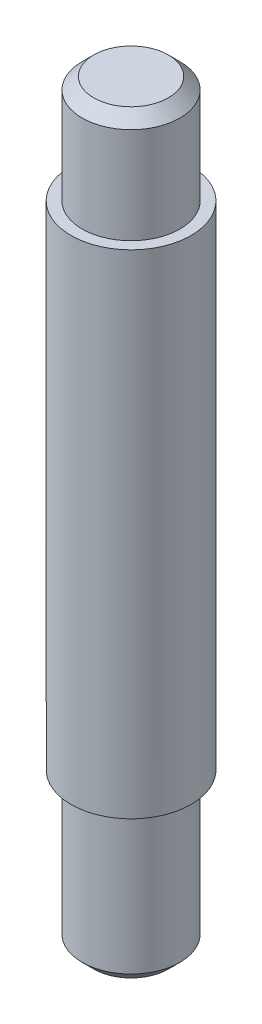
ISO-10303-21;
HEADER;
FILE_DESCRIPTION(('STEP AP214'),'2;1');
FILE_NAME('part.step','',(''),(''),'','','');
FILE_SCHEMA(('AUTOMOTIVE_DESIGN { 1 0 10303 214 1 1 1 1 }'));
ENDSEC;
DATA;
#1=APPLICATION_CONTEXT('core data for automotive mechanical design processes');
#2=APPLICATION_PROTOCOL_DEFINITION('international standard','automotive_design',2000,#1);
#3=PRODUCT_CONTEXT('',#1,'mechanical');
#4=PRODUCT('Part','Part','',(#3));
#5=PRODUCT_RELATED_PRODUCT_CATEGORY('part','',(#4));
#6=PRODUCT_DEFINITION_FORMATION('','',#4);
#7=PRODUCT_DEFINITION_CONTEXT('part definition',#1,'design');
#8=PRODUCT_DEFINITION('design','',#6,#7);
#9=PRODUCT_DEFINITION_SHAPE('','',#8);
#10=(LENGTH_UNIT() NAMED_UNIT(*) SI_UNIT(.MILLI.,.METRE.));
#11=(NAMED_UNIT(*) PLANE_ANGLE_UNIT() SI_UNIT($,.RADIAN.));
#12=(NAMED_UNIT(*) SI_UNIT($,.STERADIAN.) SOLID_ANGLE_UNIT());
#13=UNCERTAINTY_MEASURE_WITH_UNIT(LENGTH_MEASURE(1.E-05),#10,'distance_accuracy_value','');
#14=(GEOMETRIC_REPRESENTATION_CONTEXT(3) GLOBAL_UNCERTAINTY_ASSIGNED_CONTEXT((#13)) GLOBAL_UNIT_ASSIGNED_CONTEXT((#10,
#11,#12)) REPRESENTATION_CONTEXT('',''));
#15=CARTESIAN_POINT('',(0.,0.,0.));
#16=DIRECTION('',(0.,0.,1.));
#17=DIRECTION('',(1.,0.,0.));
#18=AXIS2_PLACEMENT_3D('',#15,#16,#17);
#19=CARTESIAN_POINT('',(0.,44.,0.));
#20=DIRECTION('',(0.,-1.,0.));
#21=DIRECTION('',(0.,0.,-1.));
#22=AXIS2_PLACEMENT_3D('',#19,#20,#21);
#23=CYLINDRICAL_SURFACE('',#22,3.9);
#24=CARTESIAN_POINT('',(0.,5.,0.));
#25=DIRECTION('',(0.,1.,0.));
#26=DIRECTION('',(0.,0.,1.));
#27=AXIS2_PLACEMENT_3D('',#24,#25,#26);
#28=CIRCLE('',#27,3.9);
#29=CARTESIAN_POINT('',(0.,5.,3.9));
#30=VERTEX_POINT('',#29);
#31=EDGE_CURVE('E94',#30,#30,#28,.T.);
#32=ORIENTED_EDGE('',*,*,#31,.T.);
#33=EDGE_LOOP('',(#32));
#34=FACE_BOUND('',#33,.T.);
#35=CARTESIAN_POINT('',(0.,37.,0.));
#36=DIRECTION('',(0.,-1.,0.));
#37=DIRECTION('',(0.,0.,-1.));
#38=AXIS2_PLACEMENT_3D('',#35,#36,#37);
#39=CIRCLE('',#38,3.9);
#40=CARTESIAN_POINT('',(0.,37.,-3.9));
#41=VERTEX_POINT('',#40);
#42=EDGE_CURVE('E49',#41,#41,#39,.T.);
#43=ORIENTED_EDGE('',*,*,#42,.T.);
#44=EDGE_LOOP('',(#43));
#45=FACE_BOUND('',#44,.T.);
#46=ADVANCED_FACE('F43',(#34,#45),#23,.T.);
#47=CARTESIAN_POINT('',(0.,44.,0.));
#48=DIRECTION('',(0.,-1.,0.));
#49=DIRECTION('',(0.,0.,-1.));
#50=AXIS2_PLACEMENT_3D('',#47,#48,#49);
#51=CYLINDRICAL_SURFACE('',#50,3.175);
#52=CARTESIAN_POINT('',(0.,37.,0.));
#53=DIRECTION('',(0.,-1.,0.));
#54=DIRECTION('',(0.,0.,-1.));
#55=AXIS2_PLACEMENT_3D('',#52,#53,#54);
#56=CIRCLE('',#55,3.175);
#57=CARTESIAN_POINT('',(0.,37.,-3.175));
#58=VERTEX_POINT('',#57);
#59=EDGE_CURVE('E11',#58,#58,#56,.T.);
#60=ORIENTED_EDGE('',*,*,#59,.F.);
#61=EDGE_LOOP('',(#60));
#62=FACE_BOUND('',#61,.T.);
#63=CARTESIAN_POINT('',(0.,43.24435,0.));
#64=DIRECTION('',(0.,-1.,0.));
#65=DIRECTION('',(0.,0.,-1.));
#66=AXIS2_PLACEMENT_3D('',#63,#64,#65);
#67=CIRCLE('',#66,3.175);
#68=CARTESIAN_POINT('',(0.,43.24435,-3.175));
#69=VERTEX_POINT('',#68);
#70=EDGE_CURVE('E99',#69,#69,#67,.T.);
#71=ORIENTED_EDGE('',*,*,#70,.T.);
#72=EDGE_LOOP('',(#71));
#73=FACE_BOUND('',#72,.T.);
#74=ADVANCED_FACE('F114',(#62,#73),#51,.T.);
#75=CARTESIAN_POINT('',(3.175,37.,0.));
#76=DIRECTION('',(0.,-1.,0.));
#77=DIRECTION('',(0.,0.,-1.));
#78=AXIS2_PLACEMENT_3D('',#75,#76,#77);
#79=PLANE('',#78);
#80=ORIENTED_EDGE('',*,*,#42,.F.);
#81=EDGE_LOOP('',(#80));
#82=FACE_BOUND('',#81,.T.);
#83=ORIENTED_EDGE('',*,*,#59,.T.);
#84=EDGE_LOOP('',(#83));
#85=FACE_BOUND('',#84,.T.);
#86=ADVANCED_FACE('F108',(#82,#85),#79,.F.);
#87=CARTESIAN_POINT('',(0.,44.,0.));
#88=DIRECTION('',(0.,-1.,0.));
#89=DIRECTION('',(0.,0.,-1.));
#90=AXIS2_PLACEMENT_3D('',#87,#88,#89);
#91=CONICAL_SURFACE('',#90,2.41935,0.785398163397459);
#92=ORIENTED_EDGE('',*,*,#70,.F.);
#93=EDGE_LOOP('',(#92));
#94=FACE_BOUND('',#93,.T.);
#95=CARTESIAN_POINT('',(0.,44.,0.));
#96=DIRECTION('',(0.,-1.,0.));
#97=DIRECTION('',(0.,0.,-1.));
#98=AXIS2_PLACEMENT_3D('',#95,#96,#97);
#99=CIRCLE('',#98,2.41935);
#100=CARTESIAN_POINT('',(0.,44.,-2.41935));
#101=VERTEX_POINT('',#100);
#102=EDGE_CURVE('E103',#101,#101,#99,.T.);
#103=ORIENTED_EDGE('',*,*,#102,.T.);
#104=EDGE_LOOP('',(#103));
#105=FACE_BOUND('',#104,.T.);
#106=ADVANCED_FACE('F115',(#94,#105),#91,.T.);
#107=CARTESIAN_POINT('',(0.,44.,0.));
#108=DIRECTION('',(0.,1.,0.));
#109=DIRECTION('',(0.,0.,1.));
#110=AXIS2_PLACEMENT_3D('',#107,#108,#109);
#111=PLANE('',#110);
#112=ORIENTED_EDGE('',*,*,#102,.F.);
#113=EDGE_LOOP('',(#112));
#114=FACE_BOUND('',#113,.T.);
#115=ADVANCED_FACE('F124',(#114),#111,.T.);
#116=CARTESIAN_POINT('',(0.,-5.,0.));
#117=DIRECTION('',(0.,1.,0.));
#118=DIRECTION('',(0.,0.,1.));
#119=AXIS2_PLACEMENT_3D('',#116,#117,#118);
#120=CYLINDRICAL_SURFACE('',#119,3.175);
#121=CARTESIAN_POINT('',(0.,5.,0.));
#122=DIRECTION('',(0.,1.,0.));
#123=DIRECTION('',(0.,0.,1.));
#124=AXIS2_PLACEMENT_3D('',#121,#122,#123);
#125=CIRCLE('',#124,3.175);
#126=CARTESIAN_POINT('',(0.,5.,3.175));
#127=VERTEX_POINT('',#126);
#128=EDGE_CURVE('E100',#127,#127,#125,.T.);
#129=ORIENTED_EDGE('',*,*,#128,.F.);
#130=EDGE_LOOP('',(#129));
#131=FACE_BOUND('',#130,.T.);
#132=CARTESIAN_POINT('',(0.,-4.24435000000001,0.));
#133=DIRECTION('',(0.,1.,0.));
#134=DIRECTION('',(0.,0.,1.));
#135=AXIS2_PLACEMENT_3D('',#132,#133,#134);
#136=CIRCLE('',#135,3.175);
#137=CARTESIAN_POINT('',(0.,-4.24435000000001,3.175));
#138=VERTEX_POINT('',#137);
#139=EDGE_CURVE('E71',#138,#138,#136,.T.);
#140=ORIENTED_EDGE('',*,*,#139,.T.);
#141=EDGE_LOOP('',(#140));
#142=FACE_BOUND('',#141,.T.);
#143=ADVANCED_FACE('F129',(#131,#142),#120,.T.);
#144=CARTESIAN_POINT('',(3.175,5.,0.));
#145=DIRECTION('',(0.,1.,0.));
#146=DIRECTION('',(0.,0.,1.));
#147=AXIS2_PLACEMENT_3D('',#144,#145,#146);
#148=PLANE('',#147);
#149=ORIENTED_EDGE('',*,*,#31,.F.);
#150=EDGE_LOOP('',(#149));
#151=FACE_BOUND('',#150,.T.);
#152=ORIENTED_EDGE('',*,*,#128,.T.);
#153=EDGE_LOOP('',(#152));
#154=FACE_BOUND('',#153,.T.);
#155=ADVANCED_FACE('F134',(#151,#154),#148,.F.);
#156=CARTESIAN_POINT('',(0.,-5.,0.));
#157=DIRECTION('',(0.,1.,0.));
#158=DIRECTION('',(0.,0.,1.));
#159=AXIS2_PLACEMENT_3D('',#156,#157,#158);
#160=CONICAL_SURFACE('',#159,2.41935,0.785398163397456);
#161=ORIENTED_EDGE('',*,*,#139,.F.);
#162=EDGE_LOOP('',(#161));
#163=FACE_BOUND('',#162,.T.);
#164=CARTESIAN_POINT('',(0.,-5.,0.));
#165=DIRECTION('',(0.,1.,0.));
#166=DIRECTION('',(0.,0.,1.));
#167=AXIS2_PLACEMENT_3D('',#164,#165,#166);
#168=CIRCLE('',#167,2.41935);
#169=CARTESIAN_POINT('',(0.,-5.,2.41935));
#170=VERTEX_POINT('',#169);
#171=EDGE_CURVE('E93',#170,#170,#168,.T.);
#172=ORIENTED_EDGE('',*,*,#171,.T.);
#173=EDGE_LOOP('',(#172));
#174=FACE_BOUND('',#173,.T.);
#175=ADVANCED_FACE('F148',(#163,#174),#160,.T.);
#176=CARTESIAN_POINT('',(0.,-5.,0.));
#177=DIRECTION('',(0.,-1.,0.));
#178=DIRECTION('',(0.,0.,-1.));
#179=AXIS2_PLACEMENT_3D('',#176,#177,#178);
#180=PLANE('',#179);
#181=CARTESIAN_POINT('',(0.,-5.,0.));
#182=DIRECTION('',(0.,-1.,0.));
#183=DIRECTION('',(0.,0.,-1.));
#184=AXIS2_PLACEMENT_3D('',#181,#182,#183);
#185=CIRCLE('',#184,2.);
#186=CARTESIAN_POINT('',(-1.83986981464341,-5.,0.784142248041795));
#187=VERTEX_POINT('',#186);
#188=CARTESIAN_POINT('',(0.828669593410264,-5.,1.8202490777246));
#189=VERTEX_POINT('',#188);
#190=EDGE_CURVE('E60',#187,#189,#185,.T.);
#191=ORIENTED_EDGE('',*,*,#190,.F.);
#192=DIRECTION('',(-0.932200245054097,0.,-0.361942955617432));
#193=VECTOR('',#192,1.);
#194=CARTESIAN_POINT('',(-1.83986981464341,-5.,0.784142248041795));
#195=LINE('',#194,#193);
#196=EDGE_CURVE('E80',#189,#187,#195,.T.);
#197=ORIENTED_EDGE('',*,*,#196,.F.);
#198=EDGE_LOOP('',(#191,#197));
#199=FACE_BOUND('',#198,.T.);
#200=ORIENTED_EDGE('',*,*,#171,.F.);
#201=EDGE_LOOP('',(#200));
#202=FACE_BOUND('',#201,.T.);
#203=ADVANCED_FACE('F83',(#199,#202),#180,.T.);
#204=CARTESIAN_POINT('',(0.,10.,0.));
#205=DIRECTION('',(0.,-1.,0.));
#206=DIRECTION('',(0.,0.,-1.));
#207=AXIS2_PLACEMENT_3D('',#204,#205,#206);
#208=CYLINDRICAL_SURFACE('',#207,2.);
#209=ORIENTED_EDGE('',*,*,#190,.T.);
#210=DIRECTION('',(0.,-1.,0.));
#211=VECTOR('',#210,1.);
#212=CARTESIAN_POINT('',(0.828669593410264,10.,1.8202490777246));
#213=LINE('',#212,#211);
#214=CARTESIAN_POINT('',(0.828669593410264,10.,1.8202490777246));
#215=VERTEX_POINT('',#214);
#216=EDGE_CURVE('E74',#215,#189,#213,.T.);
#217=ORIENTED_EDGE('',*,*,#216,.F.);
#218=CARTESIAN_POINT('',(0.,10.,0.));
#219=DIRECTION('',(0.,-1.,0.));
#220=DIRECTION('',(0.,0.,-1.));
#221=AXIS2_PLACEMENT_3D('',#218,#219,#220);
#222=CIRCLE('',#221,2.);
#223=CARTESIAN_POINT('',(-1.83986981464341,10.,0.784142248041795));
#224=VERTEX_POINT('',#223);
#225=EDGE_CURVE('E72',#224,#215,#222,.T.);
#226=ORIENTED_EDGE('',*,*,#225,.F.);
#227=DIRECTION('',(0.,-1.,0.));
#228=VECTOR('',#227,1.);
#229=CARTESIAN_POINT('',(-1.83986981464341,10.,0.784142248041795));
#230=LINE('',#229,#228);
#231=EDGE_CURVE('E64',#224,#187,#230,.T.);
#232=ORIENTED_EDGE('',*,*,#231,.T.);
#233=EDGE_LOOP('',(#209,#217,#226,#232));
#234=FACE_BOUND('',#233,.T.);
#235=ADVANCED_FACE('F69',(#234),#208,.F.);
#236=CARTESIAN_POINT('',(-1.83986981464341,10.,0.784142248041795));
#237=DIRECTION('',(-0.361942955617432,0.,0.932200245054097));
#238=DIRECTION('',(0.932200245054097,0.,0.361942955617432));
#239=AXIS2_PLACEMENT_3D('',#236,#237,#238);
#240=PLANE('',#239);
#241=ORIENTED_EDGE('',*,*,#196,.T.);
#242=ORIENTED_EDGE('',*,*,#231,.F.);
#243=DIRECTION('',(-0.932200245054097,0.,-0.361942955617432));
#244=VECTOR('',#243,1.);
#245=CARTESIAN_POINT('',(-1.83986981464341,10.,0.784142248041795));
#246=LINE('',#245,#244);
#247=EDGE_CURVE('E82',#215,#224,#246,.T.);
#248=ORIENTED_EDGE('',*,*,#247,.F.);
#249=ORIENTED_EDGE('',*,*,#216,.T.);
#250=EDGE_LOOP('',(#241,#242,#248,#249));
#251=FACE_BOUND('',#250,.T.);
#252=ADVANCED_FACE('F77',(#251),#240,.F.);
#253=CARTESIAN_POINT('',(0.,10.,0.));
#254=DIRECTION('',(0.,-1.,0.));
#255=DIRECTION('',(0.,0.,-1.));
#256=AXIS2_PLACEMENT_3D('',#253,#254,#255);
#257=PLANE('',#256);
#258=ORIENTED_EDGE('',*,*,#225,.T.);
#259=ORIENTED_EDGE('',*,*,#247,.T.);
#260=EDGE_LOOP('',(#258,#259));
#261=FACE_BOUND('',#260,.T.);
#262=ADVANCED_FACE('F167',(#261),#257,.T.);
#263=CLOSED_SHELL('',(#46,#74,#86,#106,#115,#143,#155,#175,#203,#235,#252,#262));
#264=MANIFOLD_SOLID_BREP('B2',#263);
#265=ADVANCED_BREP_SHAPE_REPRESENTATION('',(#18,#264),#14);
#266=SHAPE_DEFINITION_REPRESENTATION(#9,#265);
ENDSEC;
END-ISO-10303-21;
